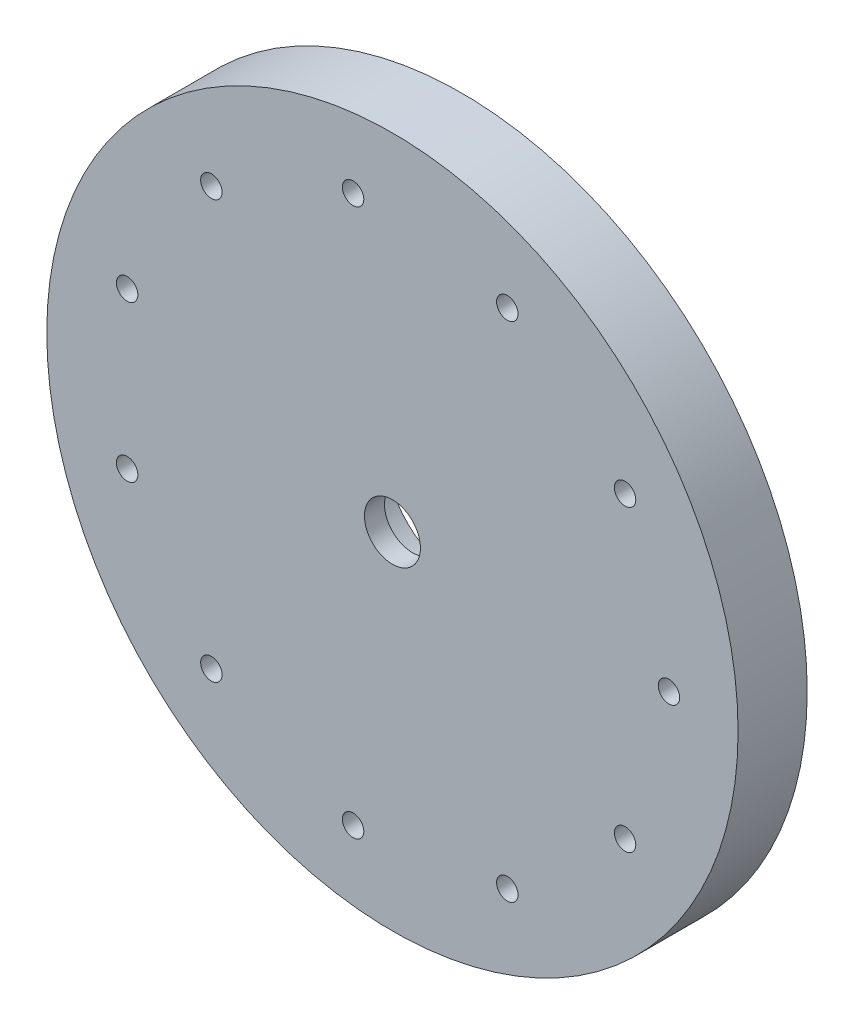
ISO-10303-21;
HEADER;
FILE_DESCRIPTION(('STEP AP214'),'2;1');
FILE_NAME('part.step','',(''),(''),'','','');
FILE_SCHEMA(('AUTOMOTIVE_DESIGN { 1 0 10303 214 1 1 1 1 }'));
ENDSEC;
DATA;
#1=APPLICATION_CONTEXT('core data for automotive mechanical design processes');
#2=APPLICATION_PROTOCOL_DEFINITION('international standard','automotive_design',2000,#1);
#3=PRODUCT_CONTEXT('',#1,'mechanical');
#4=PRODUCT('Part','Part','',(#3));
#5=PRODUCT_RELATED_PRODUCT_CATEGORY('part','',(#4));
#6=PRODUCT_DEFINITION_FORMATION('','',#4);
#7=PRODUCT_DEFINITION_CONTEXT('part definition',#1,'design');
#8=PRODUCT_DEFINITION('design','',#6,#7);
#9=PRODUCT_DEFINITION_SHAPE('','',#8);
#10=(LENGTH_UNIT() NAMED_UNIT(*) SI_UNIT(.MILLI.,.METRE.));
#11=(NAMED_UNIT(*) PLANE_ANGLE_UNIT() SI_UNIT($,.RADIAN.));
#12=(NAMED_UNIT(*) SI_UNIT($,.STERADIAN.) SOLID_ANGLE_UNIT());
#13=UNCERTAINTY_MEASURE_WITH_UNIT(LENGTH_MEASURE(1.E-05),#10,'distance_accuracy_value','');
#14=(GEOMETRIC_REPRESENTATION_CONTEXT(3) GLOBAL_UNCERTAINTY_ASSIGNED_CONTEXT((#13)) GLOBAL_UNIT_ASSIGNED_CONTEXT((#10,
#11,#12)) REPRESENTATION_CONTEXT('',''));
#15=CARTESIAN_POINT('',(0.,0.,0.));
#16=DIRECTION('',(0.,0.,1.));
#17=DIRECTION('',(1.,0.,0.));
#18=AXIS2_PLACEMENT_3D('',#15,#16,#17);
#19=CARTESIAN_POINT('',(0.,0.,10.));
#20=DIRECTION('',(0.,0.,-1.));
#21=DIRECTION('',(-1.,0.,0.));
#22=AXIS2_PLACEMENT_3D('',#19,#20,#21);
#23=CYLINDRICAL_SURFACE('',#22,11.05);
#24=CARTESIAN_POINT('',(0.,0.,0.));
#25=DIRECTION('',(0.,0.,1.));
#26=DIRECTION('',(1.,0.,0.));
#27=AXIS2_PLACEMENT_3D('',#24,#25,#26);
#28=CIRCLE('',#27,11.05);
#29=CARTESIAN_POINT('',(11.05,0.,0.));
#30=VERTEX_POINT('',#29);
#31=EDGE_CURVE('E42',#30,#30,#28,.T.);
#32=ORIENTED_EDGE('',*,*,#31,.F.);
#33=EDGE_LOOP('',(#32));
#34=FACE_BOUND('',#33,.T.);
#35=CARTESIAN_POINT('',(0.,0.,7.1));
#36=DIRECTION('',(0.,0.,1.));
#37=DIRECTION('',(1.,0.,0.));
#38=AXIS2_PLACEMENT_3D('',#35,#36,#37);
#39=CIRCLE('',#38,11.05);
#40=CARTESIAN_POINT('',(11.05,0.,7.1));
#41=VERTEX_POINT('',#40);
#42=EDGE_CURVE('E110',#41,#41,#39,.T.);
#43=ORIENTED_EDGE('',*,*,#42,.T.);
#44=EDGE_LOOP('',(#43));
#45=FACE_BOUND('',#44,.T.);
#46=ADVANCED_FACE('F31',(#34,#45),#23,.F.);
#47=CARTESIAN_POINT('',(0.,0.,10.));
#48=DIRECTION('',(0.,0.,1.));
#49=DIRECTION('',(1.,0.,0.));
#50=AXIS2_PLACEMENT_3D('',#47,#48,#49);
#51=PLANE('',#50);
#52=CARTESIAN_POINT('',(16.6166005200759,36.3852798141805,10.));
#53=DIRECTION('',(0.,0.,1.));
#54=DIRECTION('',(1.,0.,0.));
#55=AXIS2_PLACEMENT_3D('',#52,#53,#54);
#56=CIRCLE('',#55,1.54999999999999);
#57=CARTESIAN_POINT('',(18.1666005200759,36.3852798141805,10.));
#58=VERTEX_POINT('',#57);
#59=EDGE_CURVE('E98',#58,#58,#56,.T.);
#60=ORIENTED_EDGE('',*,*,#59,.F.);
#61=EDGE_LOOP('',(#60));
#62=FACE_BOUND('',#61,.T.);
#63=CARTESIAN_POINT('',(-26.1944293578111,30.2299829741706,10.));
#64=DIRECTION('',(0.,0.,1.));
#65=DIRECTION('',(1.,0.,0.));
#66=AXIS2_PLACEMENT_3D('',#63,#64,#65);
#67=CIRCLE('',#66,1.55);
#68=CARTESIAN_POINT('',(-24.6444293578111,30.2299829741706,10.));
#69=VERTEX_POINT('',#68);
#70=EDGE_CURVE('E86',#69,#69,#67,.T.);
#71=ORIENTED_EDGE('',*,*,#70,.F.);
#72=EDGE_LOOP('',(#71));
#73=FACE_BOUND('',#72,.T.);
#74=CARTESIAN_POINT('',(-38.37971894458,-11.2693022736569,10.));
#75=DIRECTION('',(0.,0.,1.));
#76=DIRECTION('',(1.,0.,0.));
#77=AXIS2_PLACEMENT_3D('',#74,#75,#76);
#78=CIRCLE('',#77,1.55000000000001);
#79=CARTESIAN_POINT('',(-36.82971894458,-11.2693022736569,10.));
#80=VERTEX_POINT('',#79);
#81=EDGE_CURVE('E74',#80,#80,#78,.T.);
#82=ORIENTED_EDGE('',*,*,#81,.F.);
#83=EDGE_LOOP('',(#82));
#84=FACE_BOUND('',#83,.T.);
#85=CARTESIAN_POINT('',(-5.69259353093156,-39.5928576752373,10.));
#86=DIRECTION('',(0.,0.,1.));
#87=DIRECTION('',(1.,0.,0.));
#88=AXIS2_PLACEMENT_3D('',#85,#86,#87);
#89=CIRCLE('',#88,1.55);
#90=CARTESIAN_POINT('',(-4.14259353093156,-39.5928576752373,10.));
#91=VERTEX_POINT('',#90);
#92=EDGE_CURVE('E62',#91,#91,#89,.T.);
#93=ORIENTED_EDGE('',*,*,#92,.F.);
#94=EDGE_LOOP('',(#93));
#95=FACE_BOUND('',#94,.T.);
#96=CARTESIAN_POINT('',(33.6501413132472,-21.625632698224,10.));
#97=DIRECTION('',(0.,0.,1.));
#98=DIRECTION('',(1.,0.,0.));
#99=AXIS2_PLACEMENT_3D('',#96,#97,#98);
#100=CIRCLE('',#99,1.55);
#101=CARTESIAN_POINT('',(35.2001413132472,-21.625632698224,10.));
#102=VERTEX_POINT('',#101);
#103=EDGE_CURVE('E50',#102,#102,#100,.T.);
#104=ORIENTED_EDGE('',*,*,#103,.F.);
#105=EDGE_LOOP('',(#104));
#106=FACE_BOUND('',#105,.T.);
#107=CARTESIAN_POINT('',(0.,0.,10.));
#108=DIRECTION('',(0.,0.,1.));
#109=DIRECTION('',(1.,0.,0.));
#110=AXIS2_PLACEMENT_3D('',#107,#108,#109);
#111=CIRCLE('',#110,50.);
#112=CARTESIAN_POINT('',(50.,0.,10.));
#113=VERTEX_POINT('',#112);
#114=EDGE_CURVE('E10',#113,#113,#111,.T.);
#115=ORIENTED_EDGE('',*,*,#114,.T.);
#116=EDGE_LOOP('',(#115));
#117=FACE_BOUND('',#116,.T.);
#118=CARTESIAN_POINT('',(40.,0.,10.));
#119=DIRECTION('',(0.,0.,1.));
#120=DIRECTION('',(1.,0.,0.));
#121=AXIS2_PLACEMENT_3D('',#118,#119,#120);
#122=CIRCLE('',#121,1.55);
#123=CARTESIAN_POINT('',(41.55,0.,10.));
#124=VERTEX_POINT('',#123);
#125=EDGE_CURVE('E46',#124,#124,#122,.T.);
#126=ORIENTED_EDGE('',*,*,#125,.F.);
#127=EDGE_LOOP('',(#126));
#128=FACE_BOUND('',#127,.T.);
#129=CARTESIAN_POINT('',(16.6166005200754,-36.3852798141808,10.));
#130=DIRECTION('',(0.,0.,1.));
#131=DIRECTION('',(1.,0.,0.));
#132=AXIS2_PLACEMENT_3D('',#129,#130,#131);
#133=CIRCLE('',#132,1.55);
#134=CARTESIAN_POINT('',(18.1666005200754,-36.3852798141808,10.));
#135=VERTEX_POINT('',#134);
#136=EDGE_CURVE('E56',#135,#135,#133,.T.);
#137=ORIENTED_EDGE('',*,*,#136,.F.);
#138=EDGE_LOOP('',(#137));
#139=FACE_BOUND('',#138,.T.);
#140=CARTESIAN_POINT('',(-26.1944293578116,-30.2299829741702,10.));
#141=DIRECTION('',(0.,0.,1.));
#142=DIRECTION('',(1.,0.,0.));
#143=AXIS2_PLACEMENT_3D('',#140,#141,#142);
#144=CIRCLE('',#143,1.55);
#145=CARTESIAN_POINT('',(-24.6444293578116,-30.2299829741702,10.));
#146=VERTEX_POINT('',#145);
#147=EDGE_CURVE('E68',#146,#146,#144,.T.);
#148=ORIENTED_EDGE('',*,*,#147,.F.);
#149=EDGE_LOOP('',(#148));
#150=FACE_BOUND('',#149,.T.);
#151=CARTESIAN_POINT('',(-38.3797189445798,11.2693022736575,10.));
#152=DIRECTION('',(0.,0.,1.));
#153=DIRECTION('',(1.,0.,0.));
#154=AXIS2_PLACEMENT_3D('',#151,#152,#153);
#155=CIRCLE('',#154,1.55);
#156=CARTESIAN_POINT('',(-36.8297189445798,11.2693022736575,10.));
#157=VERTEX_POINT('',#156);
#158=EDGE_CURVE('E80',#157,#157,#155,.T.);
#159=ORIENTED_EDGE('',*,*,#158,.F.);
#160=EDGE_LOOP('',(#159));
#161=FACE_BOUND('',#160,.T.);
#162=CARTESIAN_POINT('',(-5.69259353093099,39.5928576752374,10.));
#163=DIRECTION('',(0.,0.,1.));
#164=DIRECTION('',(1.,0.,0.));
#165=AXIS2_PLACEMENT_3D('',#162,#163,#164);
#166=CIRCLE('',#165,1.55000000000001);
#167=CARTESIAN_POINT('',(-4.14259353093098,39.5928576752374,10.));
#168=VERTEX_POINT('',#167);
#169=EDGE_CURVE('E92',#168,#168,#166,.T.);
#170=ORIENTED_EDGE('',*,*,#169,.F.);
#171=EDGE_LOOP('',(#170));
#172=FACE_BOUND('',#171,.T.);
#173=CARTESIAN_POINT('',(33.6501413132475,21.6256326982235,10.));
#174=DIRECTION('',(0.,0.,1.));
#175=DIRECTION('',(1.,0.,0.));
#176=AXIS2_PLACEMENT_3D('',#173,#174,#175);
#177=CIRCLE('',#176,1.55000000000001);
#178=CARTESIAN_POINT('',(35.2001413132476,21.6256326982235,10.));
#179=VERTEX_POINT('',#178);
#180=EDGE_CURVE('E104',#179,#179,#177,.T.);
#181=ORIENTED_EDGE('',*,*,#180,.F.);
#182=EDGE_LOOP('',(#181));
#183=FACE_BOUND('',#182,.T.);
#184=CARTESIAN_POINT('',(0.,0.,10.));
#185=DIRECTION('',(0.,0.,1.));
#186=DIRECTION('',(1.,0.,0.));
#187=AXIS2_PLACEMENT_3D('',#184,#185,#186);
#188=CIRCLE('',#187,4.05);
#189=CARTESIAN_POINT('',(4.05,0.,10.));
#190=VERTEX_POINT('',#189);
#191=EDGE_CURVE('E116',#190,#190,#188,.T.);
#192=ORIENTED_EDGE('',*,*,#191,.F.);
#193=EDGE_LOOP('',(#192));
#194=FACE_BOUND('',#193,.T.);
#195=ADVANCED_FACE('F131',(#62,#73,#84,#95,#106,#117,#128,#139,#150,#161,#172,#183,#194),#51,.T.);
#196=CARTESIAN_POINT('',(0.,0.,0.));
#197=DIRECTION('',(0.,0.,1.));
#198=DIRECTION('',(1.,0.,0.));
#199=AXIS2_PLACEMENT_3D('',#196,#197,#198);
#200=PLANE('',#199);
#201=CARTESIAN_POINT('',(0.,0.,0.));
#202=DIRECTION('',(0.,0.,1.));
#203=DIRECTION('',(1.,0.,0.));
#204=AXIS2_PLACEMENT_3D('',#201,#202,#203);
#205=CIRCLE('',#204,50.);
#206=CARTESIAN_POINT('',(50.,0.,0.));
#207=VERTEX_POINT('',#206);
#208=EDGE_CURVE('E35',#207,#207,#205,.T.);
#209=ORIENTED_EDGE('',*,*,#208,.F.);
#210=EDGE_LOOP('',(#209));
#211=FACE_BOUND('',#210,.T.);
#212=ORIENTED_EDGE('',*,*,#31,.T.);
#213=EDGE_LOOP('',(#212));
#214=FACE_BOUND('',#213,.T.);
#215=CARTESIAN_POINT('',(40.,0.,0.));
#216=DIRECTION('',(0.,0.,1.));
#217=DIRECTION('',(1.,0.,0.));
#218=AXIS2_PLACEMENT_3D('',#215,#216,#217);
#219=CIRCLE('',#218,1.55);
#220=CARTESIAN_POINT('',(41.55,0.,0.));
#221=VERTEX_POINT('',#220);
#222=EDGE_CURVE('E47',#221,#221,#219,.T.);
#223=ORIENTED_EDGE('',*,*,#222,.T.);
#224=EDGE_LOOP('',(#223));
#225=FACE_BOUND('',#224,.T.);
#226=CARTESIAN_POINT('',(33.6501413132472,-21.625632698224,0.));
#227=DIRECTION('',(0.,0.,1.));
#228=DIRECTION('',(1.,0.,0.));
#229=AXIS2_PLACEMENT_3D('',#226,#227,#228);
#230=CIRCLE('',#229,1.55);
#231=CARTESIAN_POINT('',(35.2001413132472,-21.625632698224,0.));
#232=VERTEX_POINT('',#231);
#233=EDGE_CURVE('E53',#232,#232,#230,.T.);
#234=ORIENTED_EDGE('',*,*,#233,.T.);
#235=EDGE_LOOP('',(#234));
#236=FACE_BOUND('',#235,.T.);
#237=CARTESIAN_POINT('',(16.6166005200754,-36.3852798141808,0.));
#238=DIRECTION('',(0.,0.,1.));
#239=DIRECTION('',(1.,0.,0.));
#240=AXIS2_PLACEMENT_3D('',#237,#238,#239);
#241=CIRCLE('',#240,1.55);
#242=CARTESIAN_POINT('',(18.1666005200754,-36.3852798141808,0.));
#243=VERTEX_POINT('',#242);
#244=EDGE_CURVE('E59',#243,#243,#241,.T.);
#245=ORIENTED_EDGE('',*,*,#244,.T.);
#246=EDGE_LOOP('',(#245));
#247=FACE_BOUND('',#246,.T.);
#248=CARTESIAN_POINT('',(-5.69259353093156,-39.5928576752373,0.));
#249=DIRECTION('',(0.,0.,1.));
#250=DIRECTION('',(1.,0.,0.));
#251=AXIS2_PLACEMENT_3D('',#248,#249,#250);
#252=CIRCLE('',#251,1.55);
#253=CARTESIAN_POINT('',(-4.14259353093156,-39.5928576752373,0.));
#254=VERTEX_POINT('',#253);
#255=EDGE_CURVE('E65',#254,#254,#252,.T.);
#256=ORIENTED_EDGE('',*,*,#255,.T.);
#257=EDGE_LOOP('',(#256));
#258=FACE_BOUND('',#257,.T.);
#259=CARTESIAN_POINT('',(-26.1944293578116,-30.2299829741702,0.));
#260=DIRECTION('',(0.,0.,1.));
#261=DIRECTION('',(1.,0.,0.));
#262=AXIS2_PLACEMENT_3D('',#259,#260,#261);
#263=CIRCLE('',#262,1.55);
#264=CARTESIAN_POINT('',(-24.6444293578116,-30.2299829741702,0.));
#265=VERTEX_POINT('',#264);
#266=EDGE_CURVE('E71',#265,#265,#263,.T.);
#267=ORIENTED_EDGE('',*,*,#266,.T.);
#268=EDGE_LOOP('',(#267));
#269=FACE_BOUND('',#268,.T.);
#270=CARTESIAN_POINT('',(-38.37971894458,-11.2693022736569,0.));
#271=DIRECTION('',(0.,0.,1.));
#272=DIRECTION('',(1.,0.,0.));
#273=AXIS2_PLACEMENT_3D('',#270,#271,#272);
#274=CIRCLE('',#273,1.55000000000001);
#275=CARTESIAN_POINT('',(-36.82971894458,-11.2693022736569,0.));
#276=VERTEX_POINT('',#275);
#277=EDGE_CURVE('E77',#276,#276,#274,.T.);
#278=ORIENTED_EDGE('',*,*,#277,.T.);
#279=EDGE_LOOP('',(#278));
#280=FACE_BOUND('',#279,.T.);
#281=CARTESIAN_POINT('',(-38.3797189445798,11.2693022736575,0.));
#282=DIRECTION('',(0.,0.,1.));
#283=DIRECTION('',(1.,0.,0.));
#284=AXIS2_PLACEMENT_3D('',#281,#282,#283);
#285=CIRCLE('',#284,1.55);
#286=CARTESIAN_POINT('',(-36.8297189445798,11.2693022736575,0.));
#287=VERTEX_POINT('',#286);
#288=EDGE_CURVE('E83',#287,#287,#285,.T.);
#289=ORIENTED_EDGE('',*,*,#288,.T.);
#290=EDGE_LOOP('',(#289));
#291=FACE_BOUND('',#290,.T.);
#292=CARTESIAN_POINT('',(-26.1944293578111,30.2299829741706,0.));
#293=DIRECTION('',(0.,0.,1.));
#294=DIRECTION('',(1.,0.,0.));
#295=AXIS2_PLACEMENT_3D('',#292,#293,#294);
#296=CIRCLE('',#295,1.55);
#297=CARTESIAN_POINT('',(-24.6444293578111,30.2299829741706,0.));
#298=VERTEX_POINT('',#297);
#299=EDGE_CURVE('E89',#298,#298,#296,.T.);
#300=ORIENTED_EDGE('',*,*,#299,.T.);
#301=EDGE_LOOP('',(#300));
#302=FACE_BOUND('',#301,.T.);
#303=CARTESIAN_POINT('',(-5.69259353093099,39.5928576752374,0.));
#304=DIRECTION('',(0.,0.,1.));
#305=DIRECTION('',(1.,0.,0.));
#306=AXIS2_PLACEMENT_3D('',#303,#304,#305);
#307=CIRCLE('',#306,1.55000000000001);
#308=CARTESIAN_POINT('',(-4.14259353093098,39.5928576752374,0.));
#309=VERTEX_POINT('',#308);
#310=EDGE_CURVE('E95',#309,#309,#307,.T.);
#311=ORIENTED_EDGE('',*,*,#310,.T.);
#312=EDGE_LOOP('',(#311));
#313=FACE_BOUND('',#312,.T.);
#314=CARTESIAN_POINT('',(16.6166005200759,36.3852798141805,0.));
#315=DIRECTION('',(0.,0.,1.));
#316=DIRECTION('',(1.,0.,0.));
#317=AXIS2_PLACEMENT_3D('',#314,#315,#316);
#318=CIRCLE('',#317,1.54999999999999);
#319=CARTESIAN_POINT('',(18.1666005200759,36.3852798141805,0.));
#320=VERTEX_POINT('',#319);
#321=EDGE_CURVE('E101',#320,#320,#318,.T.);
#322=ORIENTED_EDGE('',*,*,#321,.T.);
#323=EDGE_LOOP('',(#322));
#324=FACE_BOUND('',#323,.T.);
#325=CARTESIAN_POINT('',(33.6501413132475,21.6256326982235,0.));
#326=DIRECTION('',(0.,0.,1.));
#327=DIRECTION('',(1.,0.,0.));
#328=AXIS2_PLACEMENT_3D('',#325,#326,#327);
#329=CIRCLE('',#328,1.55000000000001);
#330=CARTESIAN_POINT('',(35.2001413132476,21.6256326982235,0.));
#331=VERTEX_POINT('',#330);
#332=EDGE_CURVE('E107',#331,#331,#329,.T.);
#333=ORIENTED_EDGE('',*,*,#332,.T.);
#334=EDGE_LOOP('',(#333));
#335=FACE_BOUND('',#334,.T.);
#336=ADVANCED_FACE('F133',(#211,#214,#225,#236,#247,#258,#269,#280,#291,#302,#313,#324,#335),
#200,.F.);
#337=CARTESIAN_POINT('',(0.,0.,10.));
#338=DIRECTION('',(0.,0.,-1.));
#339=DIRECTION('',(-1.,0.,0.));
#340=AXIS2_PLACEMENT_3D('',#337,#338,#339);
#341=CYLINDRICAL_SURFACE('',#340,50.);
#342=ORIENTED_EDGE('',*,*,#114,.F.);
#343=EDGE_LOOP('',(#342));
#344=FACE_BOUND('',#343,.T.);
#345=ORIENTED_EDGE('',*,*,#208,.T.);
#346=EDGE_LOOP('',(#345));
#347=FACE_BOUND('',#346,.T.);
#348=ADVANCED_FACE('F33',(#344,#347),#341,.T.);
#349=CARTESIAN_POINT('',(40.,0.,10.));
#350=DIRECTION('',(0.,0.,-1.));
#351=DIRECTION('',(-1.,0.,0.));
#352=AXIS2_PLACEMENT_3D('',#349,#350,#351);
#353=CYLINDRICAL_SURFACE('',#352,1.55);
#354=ORIENTED_EDGE('',*,*,#125,.T.);
#355=EDGE_LOOP('',(#354));
#356=FACE_BOUND('',#355,.T.);
#357=ORIENTED_EDGE('',*,*,#222,.F.);
#358=EDGE_LOOP('',(#357));
#359=FACE_BOUND('',#358,.T.);
#360=ADVANCED_FACE('F146',(#356,#359),#353,.F.);
#361=CARTESIAN_POINT('',(33.6501413132472,-21.625632698224,10.));
#362=DIRECTION('',(0.,0.,-1.));
#363=DIRECTION('',(-1.,0.,0.));
#364=AXIS2_PLACEMENT_3D('',#361,#362,#363);
#365=CYLINDRICAL_SURFACE('',#364,1.55);
#366=ORIENTED_EDGE('',*,*,#103,.T.);
#367=EDGE_LOOP('',(#366));
#368=FACE_BOUND('',#367,.T.);
#369=ORIENTED_EDGE('',*,*,#233,.F.);
#370=EDGE_LOOP('',(#369));
#371=FACE_BOUND('',#370,.T.);
#372=ADVANCED_FACE('F149',(#368,#371),#365,.F.);
#373=CARTESIAN_POINT('',(16.6166005200754,-36.3852798141808,10.));
#374=DIRECTION('',(0.,0.,-1.));
#375=DIRECTION('',(-1.,0.,0.));
#376=AXIS2_PLACEMENT_3D('',#373,#374,#375);
#377=CYLINDRICAL_SURFACE('',#376,1.55);
#378=ORIENTED_EDGE('',*,*,#136,.T.);
#379=EDGE_LOOP('',(#378));
#380=FACE_BOUND('',#379,.T.);
#381=ORIENTED_EDGE('',*,*,#244,.F.);
#382=EDGE_LOOP('',(#381));
#383=FACE_BOUND('',#382,.T.);
#384=ADVANCED_FACE('F153',(#380,#383),#377,.F.);
#385=CARTESIAN_POINT('',(-5.69259353093156,-39.5928576752373,10.));
#386=DIRECTION('',(0.,0.,-1.));
#387=DIRECTION('',(-1.,0.,0.));
#388=AXIS2_PLACEMENT_3D('',#385,#386,#387);
#389=CYLINDRICAL_SURFACE('',#388,1.55);
#390=ORIENTED_EDGE('',*,*,#92,.T.);
#391=EDGE_LOOP('',(#390));
#392=FACE_BOUND('',#391,.T.);
#393=ORIENTED_EDGE('',*,*,#255,.F.);
#394=EDGE_LOOP('',(#393));
#395=FACE_BOUND('',#394,.T.);
#396=ADVANCED_FACE('F157',(#392,#395),#389,.F.);
#397=CARTESIAN_POINT('',(-26.1944293578116,-30.2299829741702,10.));
#398=DIRECTION('',(0.,0.,-1.));
#399=DIRECTION('',(-1.,0.,0.));
#400=AXIS2_PLACEMENT_3D('',#397,#398,#399);
#401=CYLINDRICAL_SURFACE('',#400,1.55);
#402=ORIENTED_EDGE('',*,*,#147,.T.);
#403=EDGE_LOOP('',(#402));
#404=FACE_BOUND('',#403,.T.);
#405=ORIENTED_EDGE('',*,*,#266,.F.);
#406=EDGE_LOOP('',(#405));
#407=FACE_BOUND('',#406,.T.);
#408=ADVANCED_FACE('F161',(#404,#407),#401,.F.);
#409=CARTESIAN_POINT('',(-38.37971894458,-11.2693022736569,10.));
#410=DIRECTION('',(0.,0.,-1.));
#411=DIRECTION('',(-1.,0.,0.));
#412=AXIS2_PLACEMENT_3D('',#409,#410,#411);
#413=CYLINDRICAL_SURFACE('',#412,1.55000000000001);
#414=ORIENTED_EDGE('',*,*,#81,.T.);
#415=EDGE_LOOP('',(#414));
#416=FACE_BOUND('',#415,.T.);
#417=ORIENTED_EDGE('',*,*,#277,.F.);
#418=EDGE_LOOP('',(#417));
#419=FACE_BOUND('',#418,.T.);
#420=ADVANCED_FACE('F165',(#416,#419),#413,.F.);
#421=CARTESIAN_POINT('',(-38.3797189445798,11.2693022736575,10.));
#422=DIRECTION('',(0.,0.,-1.));
#423=DIRECTION('',(-1.,0.,0.));
#424=AXIS2_PLACEMENT_3D('',#421,#422,#423);
#425=CYLINDRICAL_SURFACE('',#424,1.55);
#426=ORIENTED_EDGE('',*,*,#158,.T.);
#427=EDGE_LOOP('',(#426));
#428=FACE_BOUND('',#427,.T.);
#429=ORIENTED_EDGE('',*,*,#288,.F.);
#430=EDGE_LOOP('',(#429));
#431=FACE_BOUND('',#430,.T.);
#432=ADVANCED_FACE('F169',(#428,#431),#425,.F.);
#433=CARTESIAN_POINT('',(-26.1944293578111,30.2299829741706,10.));
#434=DIRECTION('',(0.,0.,-1.));
#435=DIRECTION('',(-1.,0.,0.));
#436=AXIS2_PLACEMENT_3D('',#433,#434,#435);
#437=CYLINDRICAL_SURFACE('',#436,1.55);
#438=ORIENTED_EDGE('',*,*,#70,.T.);
#439=EDGE_LOOP('',(#438));
#440=FACE_BOUND('',#439,.T.);
#441=ORIENTED_EDGE('',*,*,#299,.F.);
#442=EDGE_LOOP('',(#441));
#443=FACE_BOUND('',#442,.T.);
#444=ADVANCED_FACE('F173',(#440,#443),#437,.F.);
#445=CARTESIAN_POINT('',(-5.69259353093099,39.5928576752374,10.));
#446=DIRECTION('',(0.,0.,-1.));
#447=DIRECTION('',(-1.,0.,0.));
#448=AXIS2_PLACEMENT_3D('',#445,#446,#447);
#449=CYLINDRICAL_SURFACE('',#448,1.55000000000001);
#450=ORIENTED_EDGE('',*,*,#169,.T.);
#451=EDGE_LOOP('',(#450));
#452=FACE_BOUND('',#451,.T.);
#453=ORIENTED_EDGE('',*,*,#310,.F.);
#454=EDGE_LOOP('',(#453));
#455=FACE_BOUND('',#454,.T.);
#456=ADVANCED_FACE('F177',(#452,#455),#449,.F.);
#457=CARTESIAN_POINT('',(16.6166005200759,36.3852798141805,10.));
#458=DIRECTION('',(0.,0.,-1.));
#459=DIRECTION('',(-1.,0.,0.));
#460=AXIS2_PLACEMENT_3D('',#457,#458,#459);
#461=CYLINDRICAL_SURFACE('',#460,1.54999999999999);
#462=ORIENTED_EDGE('',*,*,#59,.T.);
#463=EDGE_LOOP('',(#462));
#464=FACE_BOUND('',#463,.T.);
#465=ORIENTED_EDGE('',*,*,#321,.F.);
#466=EDGE_LOOP('',(#465));
#467=FACE_BOUND('',#466,.T.);
#468=ADVANCED_FACE('F181',(#464,#467),#461,.F.);
#469=CARTESIAN_POINT('',(33.6501413132475,21.6256326982235,10.));
#470=DIRECTION('',(0.,0.,-1.));
#471=DIRECTION('',(-1.,0.,0.));
#472=AXIS2_PLACEMENT_3D('',#469,#470,#471);
#473=CYLINDRICAL_SURFACE('',#472,1.55000000000001);
#474=ORIENTED_EDGE('',*,*,#180,.T.);
#475=EDGE_LOOP('',(#474));
#476=FACE_BOUND('',#475,.T.);
#477=ORIENTED_EDGE('',*,*,#332,.F.);
#478=EDGE_LOOP('',(#477));
#479=FACE_BOUND('',#478,.T.);
#480=ADVANCED_FACE('F185',(#476,#479),#473,.F.);
#481=CARTESIAN_POINT('',(0.,0.,7.1));
#482=DIRECTION('',(0.,0.,1.));
#483=DIRECTION('',(1.,0.,0.));
#484=AXIS2_PLACEMENT_3D('',#481,#482,#483);
#485=PLANE('',#484);
#486=CARTESIAN_POINT('',(0.,0.,7.1));
#487=DIRECTION('',(0.,0.,1.));
#488=DIRECTION('',(1.,0.,0.));
#489=AXIS2_PLACEMENT_3D('',#486,#487,#488);
#490=CIRCLE('',#489,4.05);
#491=CARTESIAN_POINT('',(4.05,0.,7.1));
#492=VERTEX_POINT('',#491);
#493=EDGE_CURVE('E115',#492,#492,#490,.T.);
#494=ORIENTED_EDGE('',*,*,#493,.T.);
#495=EDGE_LOOP('',(#494));
#496=FACE_BOUND('',#495,.T.);
#497=ORIENTED_EDGE('',*,*,#42,.F.);
#498=EDGE_LOOP('',(#497));
#499=FACE_BOUND('',#498,.T.);
#500=ADVANCED_FACE('F122',(#496,#499),#485,.F.);
#501=CARTESIAN_POINT('',(0.,0.,7.1));
#502=DIRECTION('',(0.,0.,1.));
#503=DIRECTION('',(1.,0.,0.));
#504=AXIS2_PLACEMENT_3D('',#501,#502,#503);
#505=CYLINDRICAL_SURFACE('',#504,4.05);
#506=ORIENTED_EDGE('',*,*,#493,.F.);
#507=EDGE_LOOP('',(#506));
#508=FACE_BOUND('',#507,.T.);
#509=ORIENTED_EDGE('',*,*,#191,.T.);
#510=EDGE_LOOP('',(#509));
#511=FACE_BOUND('',#510,.T.);
#512=ADVANCED_FACE('F125',(#508,#511),#505,.F.);
#513=CLOSED_SHELL('',(#46,#195,#336,#348,#360,#372,#384,#396,#408,#420,#432,#444,#456,#468,#480,
#500,#512));
#514=MANIFOLD_SOLID_BREP('B2',#513);
#515=ADVANCED_BREP_SHAPE_REPRESENTATION('',(#18,#514),#14);
#516=SHAPE_DEFINITION_REPRESENTATION(#9,#515);
ENDSEC;
END-ISO-10303-21;
